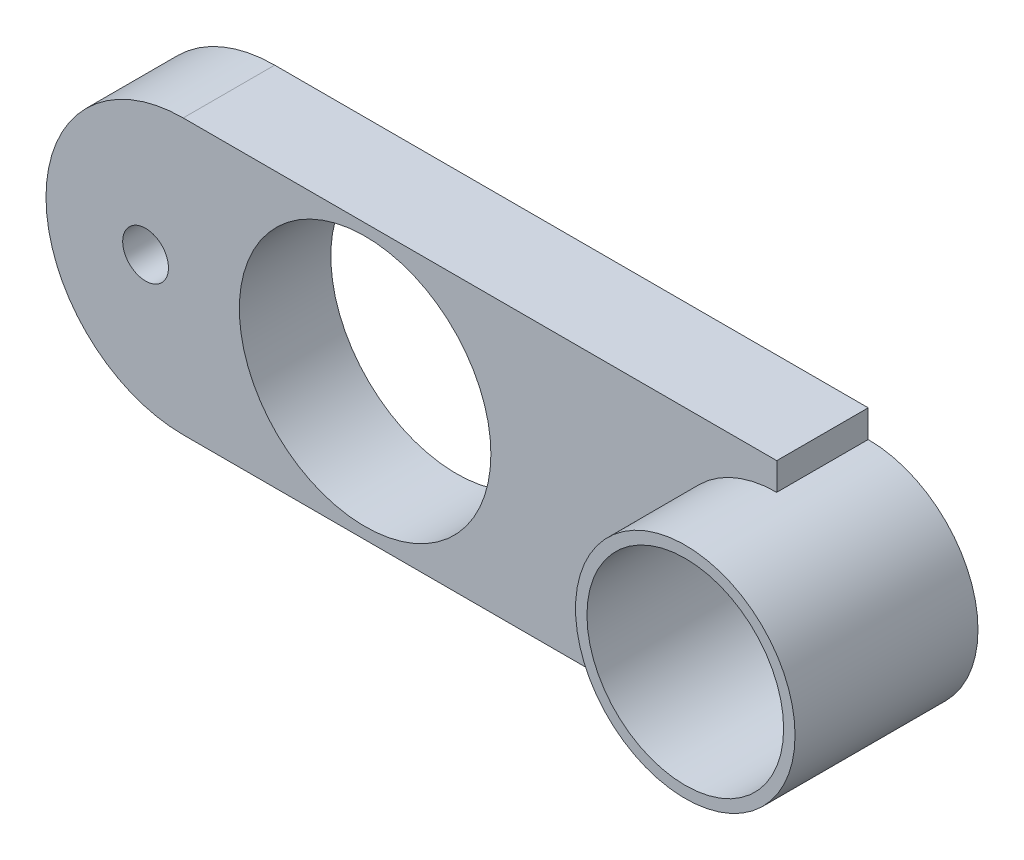
ISO-10303-21;
HEADER;
FILE_DESCRIPTION(('STEP AP214'),'2;1');
FILE_NAME('part.step','',(''),(''),'','','');
FILE_SCHEMA(('AUTOMOTIVE_DESIGN { 1 0 10303 214 1 1 1 1 }'));
ENDSEC;
DATA;
#1=APPLICATION_CONTEXT('core data for automotive mechanical design processes');
#2=APPLICATION_PROTOCOL_DEFINITION('international standard','automotive_design',2000,#1);
#3=PRODUCT_CONTEXT('',#1,'mechanical');
#4=PRODUCT('Part','Part','',(#3));
#5=PRODUCT_RELATED_PRODUCT_CATEGORY('part','',(#4));
#6=PRODUCT_DEFINITION_FORMATION('','',#4);
#7=PRODUCT_DEFINITION_CONTEXT('part definition',#1,'design');
#8=PRODUCT_DEFINITION('design','',#6,#7);
#9=PRODUCT_DEFINITION_SHAPE('','',#8);
#10=(LENGTH_UNIT() NAMED_UNIT(*) SI_UNIT(.MILLI.,.METRE.));
#11=(NAMED_UNIT(*) PLANE_ANGLE_UNIT() SI_UNIT($,.RADIAN.));
#12=(NAMED_UNIT(*) SI_UNIT($,.STERADIAN.) SOLID_ANGLE_UNIT());
#13=UNCERTAINTY_MEASURE_WITH_UNIT(LENGTH_MEASURE(1.E-05),#10,'distance_accuracy_value','');
#14=(GEOMETRIC_REPRESENTATION_CONTEXT(3) GLOBAL_UNCERTAINTY_ASSIGNED_CONTEXT((#13)) GLOBAL_UNIT_ASSIGNED_CONTEXT((#10,
#11,#12)) REPRESENTATION_CONTEXT('',''));
#15=CARTESIAN_POINT('',(0.,0.,0.));
#16=DIRECTION('',(0.,0.,1.));
#17=DIRECTION('',(1.,0.,0.));
#18=AXIS2_PLACEMENT_3D('',#15,#16,#17);
#19=CARTESIAN_POINT('',(-39.7700446225227,0.,0.));
#20=DIRECTION('',(0.,0.,-1.));
#21=DIRECTION('',(-1.,0.,0.));
#22=AXIS2_PLACEMENT_3D('',#19,#20,#21);
#23=CYLINDRICAL_SURFACE('',#22,30.);
#24=DIRECTION('',(0.,0.,1.));
#25=VECTOR('',#24,1.);
#26=CARTESIAN_POINT('',(-39.7700446225227,30.,0.));
#27=LINE('',#26,#25);
#28=CARTESIAN_POINT('',(-39.7700446225227,30.,0.));
#29=VERTEX_POINT('',#28);
#30=CARTESIAN_POINT('',(-39.7700446225227,30.,20.));
#31=VERTEX_POINT('',#30);
#32=EDGE_CURVE('E165',#29,#31,#27,.T.);
#33=ORIENTED_EDGE('',*,*,#32,.F.);
#34=CARTESIAN_POINT('',(-39.7700446225227,0.,0.));
#35=DIRECTION('',(0.,0.,1.));
#36=DIRECTION('',(1.,0.,0.));
#37=AXIS2_PLACEMENT_3D('',#34,#35,#36);
#38=CIRCLE('',#37,30.);
#39=CARTESIAN_POINT('',(-69.7700446225227,0.,0.));
#40=VERTEX_POINT('',#39);
#41=EDGE_CURVE('E44',#40,#29,#38,.F.);
#42=ORIENTED_EDGE('',*,*,#41,.F.);
#43=DIRECTION('',(0.,0.,-1.));
#44=VECTOR('',#43,1.);
#45=CARTESIAN_POINT('',(-69.7700446225227,0.,0.));
#46=LINE('',#45,#44);
#47=CARTESIAN_POINT('',(-69.7700446225227,0.,20.));
#48=VERTEX_POINT('',#47);
#49=EDGE_CURVE('E159',#40,#48,#46,.F.);
#50=ORIENTED_EDGE('',*,*,#49,.T.);
#51=CARTESIAN_POINT('',(-39.7700446225227,0.,20.));
#52=DIRECTION('',(0.,0.,1.));
#53=DIRECTION('',(1.,0.,0.));
#54=AXIS2_PLACEMENT_3D('',#51,#52,#53);
#55=CIRCLE('',#54,30.);
#56=EDGE_CURVE('E11',#31,#48,#55,.T.);
#57=ORIENTED_EDGE('',*,*,#56,.F.);
#58=EDGE_LOOP('',(#33,#42,#50,#57));
#59=FACE_BOUND('',#58,.T.);
#60=ADVANCED_FACE('F37',(#59),#23,.T.);
#61=CARTESIAN_POINT('',(-39.7700446225227,0.,0.));
#62=DIRECTION('',(0.,0.,1.));
#63=DIRECTION('',(1.,0.,0.));
#64=AXIS2_PLACEMENT_3D('',#61,#62,#63);
#65=CYLINDRICAL_SURFACE('',#64,30.);
#66=DIRECTION('',(0.,0.,-1.));
#67=VECTOR('',#66,1.);
#68=CARTESIAN_POINT('',(-39.7700446225227,-30.,0.));
#69=LINE('',#68,#67);
#70=CARTESIAN_POINT('',(-39.7700446225227,-30.,20.));
#71=VERTEX_POINT('',#70);
#72=CARTESIAN_POINT('',(-39.7700446225227,-30.,0.));
#73=VERTEX_POINT('',#72);
#74=EDGE_CURVE('E154',#71,#73,#69,.T.);
#75=ORIENTED_EDGE('',*,*,#74,.F.);
#76=CARTESIAN_POINT('',(-39.7700446225227,0.,20.));
#77=DIRECTION('',(0.,0.,1.));
#78=DIRECTION('',(1.,0.,0.));
#79=AXIS2_PLACEMENT_3D('',#76,#77,#78);
#80=CIRCLE('',#79,30.);
#81=EDGE_CURVE('E161',#48,#71,#80,.T.);
#82=ORIENTED_EDGE('',*,*,#81,.F.);
#83=ORIENTED_EDGE('',*,*,#49,.F.);
#84=CARTESIAN_POINT('',(-39.7700446225227,0.,0.));
#85=DIRECTION('',(0.,0.,1.));
#86=DIRECTION('',(1.,0.,0.));
#87=AXIS2_PLACEMENT_3D('',#84,#85,#86);
#88=CIRCLE('',#87,30.);
#89=EDGE_CURVE('E163',#73,#40,#88,.F.);
#90=ORIENTED_EDGE('',*,*,#89,.F.);
#91=EDGE_LOOP('',(#75,#82,#83,#90));
#92=FACE_BOUND('',#91,.T.);
#93=ADVANCED_FACE('F172',(#92),#65,.T.);
#94=CARTESIAN_POINT('',(0.,0.,20.));
#95=DIRECTION('',(0.,0.,1.));
#96=DIRECTION('',(1.,0.,0.));
#97=AXIS2_PLACEMENT_3D('',#94,#95,#96);
#98=PLANE('',#97);
#99=CARTESIAN_POINT('',(-48.,0.,20.));
#100=DIRECTION('',(0.,0.,1.));
#101=DIRECTION('',(1.,0.,0.));
#102=AXIS2_PLACEMENT_3D('',#99,#100,#101);
#103=CIRCLE('',#102,5.);
#104=CARTESIAN_POINT('',(-43.,0.,20.));
#105=VERTEX_POINT('',#104);
#106=EDGE_CURVE('E244',#105,#105,#103,.T.);
#107=ORIENTED_EDGE('',*,*,#106,.F.);
#108=EDGE_LOOP('',(#107));
#109=FACE_BOUND('',#108,.T.);
#110=DIRECTION('',(-1.,0.,0.));
#111=VECTOR('',#110,1.);
#112=CARTESIAN_POINT('',(0.,30.,20.));
#113=LINE('',#112,#111);
#114=CARTESIAN_POINT('',(90.,30.,20.));
#115=VERTEX_POINT('',#114);
#116=EDGE_CURVE('E103',#115,#31,#113,.T.);
#117=ORIENTED_EDGE('',*,*,#116,.T.);
#118=ORIENTED_EDGE('',*,*,#56,.T.);
#119=ORIENTED_EDGE('',*,*,#81,.T.);
#120=DIRECTION('',(1.,0.,0.));
#121=VECTOR('',#120,1.);
#122=CARTESIAN_POINT('',(0.,-30.,20.));
#123=LINE('',#122,#121);
#124=CARTESIAN_POINT('',(90.,-30.,20.));
#125=VERTEX_POINT('',#124);
#126=EDGE_CURVE('E124',#71,#125,#123,.T.);
#127=ORIENTED_EDGE('',*,*,#126,.T.);
#128=DIRECTION('',(0.,1.,0.));
#129=VECTOR('',#128,1.);
#130=CARTESIAN_POINT('',(90.,-30.,20.));
#131=LINE('',#130,#129);
#132=CARTESIAN_POINT('',(90.,-24.,20.));
#133=VERTEX_POINT('',#132);
#134=EDGE_CURVE('E104',#125,#133,#131,.T.);
#135=ORIENTED_EDGE('',*,*,#134,.T.);
#136=CARTESIAN_POINT('',(90.,0.,20.));
#137=DIRECTION('',(0.,0.,1.));
#138=DIRECTION('',(1.,0.,0.));
#139=AXIS2_PLACEMENT_3D('',#136,#137,#138);
#140=CIRCLE('',#139,24.);
#141=CARTESIAN_POINT('',(90.,24.,20.));
#142=VERTEX_POINT('',#141);
#143=EDGE_CURVE('E111',#142,#133,#140,.T.);
#144=ORIENTED_EDGE('',*,*,#143,.F.);
#145=DIRECTION('',(0.,1.,0.));
#146=VECTOR('',#145,1.);
#147=CARTESIAN_POINT('',(90.,30.,20.));
#148=LINE('',#147,#146);
#149=EDGE_CURVE('E92',#142,#115,#148,.T.);
#150=ORIENTED_EDGE('',*,*,#149,.T.);
#151=EDGE_LOOP('',(#117,#118,#119,#127,#135,#144,#150));
#152=FACE_BOUND('',#151,.T.);
#153=CARTESIAN_POINT('',(0.,0.,20.));
#154=DIRECTION('',(0.,0.,1.));
#155=DIRECTION('',(1.,0.,0.));
#156=AXIS2_PLACEMENT_3D('',#153,#154,#155);
#157=CIRCLE('',#156,27.5);
#158=CARTESIAN_POINT('',(27.5,0.,20.));
#159=VERTEX_POINT('',#158);
#160=EDGE_CURVE('E146',#159,#159,#157,.T.);
#161=ORIENTED_EDGE('',*,*,#160,.F.);
#162=EDGE_LOOP('',(#161));
#163=FACE_BOUND('',#162,.T.);
#164=ADVANCED_FACE('F117',(#109,#152,#163),#98,.T.);
#165=CARTESIAN_POINT('',(0.,0.,0.));
#166=DIRECTION('',(0.,0.,1.));
#167=DIRECTION('',(1.,0.,0.));
#168=AXIS2_PLACEMENT_3D('',#165,#166,#167);
#169=PLANE('',#168);
#170=CARTESIAN_POINT('',(-48.,0.,0.));
#171=DIRECTION('',(0.,0.,1.));
#172=DIRECTION('',(1.,0.,0.));
#173=AXIS2_PLACEMENT_3D('',#170,#171,#172);
#174=CIRCLE('',#173,5.);
#175=CARTESIAN_POINT('',(-43.,0.,0.));
#176=VERTEX_POINT('',#175);
#177=EDGE_CURVE('E241',#176,#176,#174,.T.);
#178=ORIENTED_EDGE('',*,*,#177,.T.);
#179=EDGE_LOOP('',(#178));
#180=FACE_BOUND('',#179,.T.);
#181=CARTESIAN_POINT('',(0.,0.,0.));
#182=DIRECTION('',(0.,0.,1.));
#183=DIRECTION('',(1.,0.,0.));
#184=AXIS2_PLACEMENT_3D('',#181,#182,#183);
#185=CIRCLE('',#184,27.5);
#186=CARTESIAN_POINT('',(27.5,0.,0.));
#187=VERTEX_POINT('',#186);
#188=EDGE_CURVE('E151',#187,#187,#185,.T.);
#189=ORIENTED_EDGE('',*,*,#188,.T.);
#190=EDGE_LOOP('',(#189));
#191=FACE_BOUND('',#190,.T.);
#192=ORIENTED_EDGE('',*,*,#89,.T.);
#193=ORIENTED_EDGE('',*,*,#41,.T.);
#194=DIRECTION('',(-1.,0.,0.));
#195=VECTOR('',#194,1.);
#196=CARTESIAN_POINT('',(0.,30.,0.));
#197=LINE('',#196,#195);
#198=CARTESIAN_POINT('',(90.,30.,0.));
#199=VERTEX_POINT('',#198);
#200=EDGE_CURVE('E139',#199,#29,#197,.T.);
#201=ORIENTED_EDGE('',*,*,#200,.F.);
#202=DIRECTION('',(0.,1.,0.));
#203=VECTOR('',#202,1.);
#204=CARTESIAN_POINT('',(90.,30.,0.));
#205=LINE('',#204,#203);
#206=CARTESIAN_POINT('',(90.,24.,0.));
#207=VERTEX_POINT('',#206);
#208=EDGE_CURVE('E137',#207,#199,#205,.T.);
#209=ORIENTED_EDGE('',*,*,#208,.F.);
#210=CARTESIAN_POINT('',(90.,0.,0.));
#211=DIRECTION('',(0.,0.,1.));
#212=DIRECTION('',(1.,0.,0.));
#213=AXIS2_PLACEMENT_3D('',#210,#211,#212);
#214=CIRCLE('',#213,24.);
#215=CARTESIAN_POINT('',(90.,-24.,0.));
#216=VERTEX_POINT('',#215);
#217=EDGE_CURVE('E113',#216,#207,#214,.T.);
#218=ORIENTED_EDGE('',*,*,#217,.F.);
#219=DIRECTION('',(0.,1.,0.));
#220=VECTOR('',#219,1.);
#221=CARTESIAN_POINT('',(90.,-30.,0.));
#222=LINE('',#221,#220);
#223=CARTESIAN_POINT('',(90.,-30.,0.));
#224=VERTEX_POINT('',#223);
#225=EDGE_CURVE('E133',#224,#216,#222,.T.);
#226=ORIENTED_EDGE('',*,*,#225,.F.);
#227=DIRECTION('',(1.,0.,0.));
#228=VECTOR('',#227,1.);
#229=CARTESIAN_POINT('',(0.,-30.,0.));
#230=LINE('',#229,#228);
#231=EDGE_CURVE('E131',#73,#224,#230,.T.);
#232=ORIENTED_EDGE('',*,*,#231,.F.);
#233=EDGE_LOOP('',(#192,#193,#201,#209,#218,#226,#232));
#234=FACE_BOUND('',#233,.T.);
#235=ADVANCED_FACE('F175',(#180,#191,#234),#169,.F.);
#236=CARTESIAN_POINT('',(0.,0.,0.));
#237=DIRECTION('',(0.,0.,1.));
#238=DIRECTION('',(1.,0.,0.));
#239=AXIS2_PLACEMENT_3D('',#236,#237,#238);
#240=CYLINDRICAL_SURFACE('',#239,27.5);
#241=ORIENTED_EDGE('',*,*,#188,.F.);
#242=EDGE_LOOP('',(#241));
#243=FACE_BOUND('',#242,.T.);
#244=ORIENTED_EDGE('',*,*,#160,.T.);
#245=EDGE_LOOP('',(#244));
#246=FACE_BOUND('',#245,.T.);
#247=ADVANCED_FACE('F204',(#243,#246),#240,.F.);
#248=CARTESIAN_POINT('',(0.,30.,0.));
#249=DIRECTION('',(0.,1.,0.));
#250=DIRECTION('',(0.,0.,1.));
#251=AXIS2_PLACEMENT_3D('',#248,#249,#250);
#252=PLANE('',#251);
#253=ORIENTED_EDGE('',*,*,#200,.T.);
#254=ORIENTED_EDGE('',*,*,#32,.T.);
#255=ORIENTED_EDGE('',*,*,#116,.F.);
#256=DIRECTION('',(0.,0.,1.));
#257=VECTOR('',#256,1.);
#258=CARTESIAN_POINT('',(90.,30.,0.));
#259=LINE('',#258,#257);
#260=EDGE_CURVE('E98',#199,#115,#259,.T.);
#261=ORIENTED_EDGE('',*,*,#260,.F.);
#262=EDGE_LOOP('',(#253,#254,#255,#261));
#263=FACE_BOUND('',#262,.T.);
#264=ADVANCED_FACE('F167',(#263),#252,.T.);
#265=CARTESIAN_POINT('',(90.,30.,0.));
#266=DIRECTION('',(1.,0.,0.));
#267=DIRECTION('',(0.,0.,-1.));
#268=AXIS2_PLACEMENT_3D('',#265,#266,#267);
#269=PLANE('',#268);
#270=ORIENTED_EDGE('',*,*,#149,.F.);
#271=DIRECTION('',(0.,0.,1.));
#272=VECTOR('',#271,1.);
#273=CARTESIAN_POINT('',(90.,24.,0.));
#274=LINE('',#273,#272);
#275=EDGE_CURVE('E96',#207,#142,#274,.T.);
#276=ORIENTED_EDGE('',*,*,#275,.F.);
#277=ORIENTED_EDGE('',*,*,#208,.T.);
#278=ORIENTED_EDGE('',*,*,#260,.T.);
#279=EDGE_LOOP('',(#270,#276,#277,#278));
#280=FACE_BOUND('',#279,.T.);
#281=ADVANCED_FACE('F94',(#280),#269,.T.);
#282=CARTESIAN_POINT('',(90.,0.,0.));
#283=DIRECTION('',(0.,0.,1.));
#284=DIRECTION('',(1.,0.,0.));
#285=AXIS2_PLACEMENT_3D('',#282,#283,#284);
#286=CYLINDRICAL_SURFACE('',#285,24.);
#287=ORIENTED_EDGE('',*,*,#275,.T.);
#288=ORIENTED_EDGE('',*,*,#143,.T.);
#289=DIRECTION('',(0.,0.,1.));
#290=VECTOR('',#289,1.);
#291=CARTESIAN_POINT('',(90.,-24.,0.));
#292=LINE('',#291,#290);
#293=EDGE_CURVE('E114',#216,#133,#292,.T.);
#294=ORIENTED_EDGE('',*,*,#293,.F.);
#295=ORIENTED_EDGE('',*,*,#217,.T.);
#296=EDGE_LOOP('',(#287,#288,#294,#295));
#297=FACE_BOUND('',#296,.T.);
#298=CARTESIAN_POINT('',(90.,0.,40.));
#299=DIRECTION('',(0.,0.,1.));
#300=DIRECTION('',(1.,0.,0.));
#301=AXIS2_PLACEMENT_3D('',#298,#299,#300);
#302=CIRCLE('',#301,24.);
#303=CARTESIAN_POINT('',(114.,0.,40.));
#304=VERTEX_POINT('',#303);
#305=EDGE_CURVE('E120',#304,#304,#302,.T.);
#306=ORIENTED_EDGE('',*,*,#305,.F.);
#307=EDGE_LOOP('',(#306));
#308=FACE_BOUND('',#307,.T.);
#309=ADVANCED_FACE('F109',(#297,#308),#286,.T.);
#310=CARTESIAN_POINT('',(90.,-30.,0.));
#311=DIRECTION('',(1.,0.,0.));
#312=DIRECTION('',(0.,0.,-1.));
#313=AXIS2_PLACEMENT_3D('',#310,#311,#312);
#314=PLANE('',#313);
#315=ORIENTED_EDGE('',*,*,#134,.F.);
#316=DIRECTION('',(0.,0.,1.));
#317=VECTOR('',#316,1.);
#318=CARTESIAN_POINT('',(90.,-30.,0.));
#319=LINE('',#318,#317);
#320=EDGE_CURVE('E142',#224,#125,#319,.T.);
#321=ORIENTED_EDGE('',*,*,#320,.F.);
#322=ORIENTED_EDGE('',*,*,#225,.T.);
#323=ORIENTED_EDGE('',*,*,#293,.T.);
#324=EDGE_LOOP('',(#315,#321,#322,#323));
#325=FACE_BOUND('',#324,.T.);
#326=ADVANCED_FACE('F181',(#325),#314,.T.);
#327=CARTESIAN_POINT('',(0.,-30.,0.));
#328=DIRECTION('',(0.,-1.,0.));
#329=DIRECTION('',(0.,0.,-1.));
#330=AXIS2_PLACEMENT_3D('',#327,#328,#329);
#331=PLANE('',#330);
#332=ORIENTED_EDGE('',*,*,#126,.F.);
#333=ORIENTED_EDGE('',*,*,#74,.T.);
#334=ORIENTED_EDGE('',*,*,#231,.T.);
#335=ORIENTED_EDGE('',*,*,#320,.T.);
#336=EDGE_LOOP('',(#332,#333,#334,#335));
#337=FACE_BOUND('',#336,.T.);
#338=ADVANCED_FACE('F178',(#337),#331,.T.);
#339=CARTESIAN_POINT('',(90.,0.,40.));
#340=DIRECTION('',(0.,0.,1.));
#341=DIRECTION('',(1.,0.,0.));
#342=AXIS2_PLACEMENT_3D('',#339,#340,#341);
#343=PLANE('',#342);
#344=CARTESIAN_POINT('',(90.,0.,40.));
#345=DIRECTION('',(0.,0.,1.));
#346=DIRECTION('',(1.,0.,0.));
#347=AXIS2_PLACEMENT_3D('',#344,#345,#346);
#348=CIRCLE('',#347,21.5);
#349=CARTESIAN_POINT('',(111.5,0.,40.));
#350=VERTEX_POINT('',#349);
#351=EDGE_CURVE('E127',#350,#350,#348,.T.);
#352=ORIENTED_EDGE('',*,*,#351,.F.);
#353=EDGE_LOOP('',(#352));
#354=FACE_BOUND('',#353,.T.);
#355=ORIENTED_EDGE('',*,*,#305,.T.);
#356=EDGE_LOOP('',(#355));
#357=FACE_BOUND('',#356,.T.);
#358=ADVANCED_FACE('F189',(#354,#357),#343,.T.);
#359=CARTESIAN_POINT('',(90.,0.,4.99999999999999));
#360=DIRECTION('',(0.,0.,1.));
#361=DIRECTION('',(1.,0.,0.));
#362=AXIS2_PLACEMENT_3D('',#359,#360,#361);
#363=CYLINDRICAL_SURFACE('',#362,21.5);
#364=CARTESIAN_POINT('',(90.,0.,4.99999999999999));
#365=DIRECTION('',(0.,0.,1.));
#366=DIRECTION('',(1.,0.,0.));
#367=AXIS2_PLACEMENT_3D('',#364,#365,#366);
#368=CIRCLE('',#367,21.5);
#369=CARTESIAN_POINT('',(111.5,0.,4.99999999999999));
#370=VERTEX_POINT('',#369);
#371=EDGE_CURVE('E121',#370,#370,#368,.T.);
#372=ORIENTED_EDGE('',*,*,#371,.F.);
#373=EDGE_LOOP('',(#372));
#374=FACE_BOUND('',#373,.T.);
#375=ORIENTED_EDGE('',*,*,#351,.T.);
#376=EDGE_LOOP('',(#375));
#377=FACE_BOUND('',#376,.T.);
#378=ADVANCED_FACE('F225',(#374,#377),#363,.F.);
#379=CARTESIAN_POINT('',(90.,0.,4.99999999999999));
#380=DIRECTION('',(0.,0.,1.));
#381=DIRECTION('',(1.,0.,0.));
#382=AXIS2_PLACEMENT_3D('',#379,#380,#381);
#383=PLANE('',#382);
#384=ORIENTED_EDGE('',*,*,#371,.T.);
#385=EDGE_LOOP('',(#384));
#386=FACE_BOUND('',#385,.T.);
#387=ADVANCED_FACE('F229',(#386),#383,.T.);
#388=CARTESIAN_POINT('',(-48.,0.,0.));
#389=DIRECTION('',(0.,0.,1.));
#390=DIRECTION('',(1.,0.,0.));
#391=AXIS2_PLACEMENT_3D('',#388,#389,#390);
#392=CYLINDRICAL_SURFACE('',#391,5.);
#393=ORIENTED_EDGE('',*,*,#177,.F.);
#394=EDGE_LOOP('',(#393));
#395=FACE_BOUND('',#394,.T.);
#396=ORIENTED_EDGE('',*,*,#106,.T.);
#397=EDGE_LOOP('',(#396));
#398=FACE_BOUND('',#397,.T.);
#399=ADVANCED_FACE('F233',(#395,#398),#392,.F.);
#400=CLOSED_SHELL('',(#60,#93,#164,#235,#247,#264,#281,#309,#326,#338,#358,#378,#387,#399));
#401=MANIFOLD_SOLID_BREP('B2',#400);
#402=ADVANCED_BREP_SHAPE_REPRESENTATION('',(#18,#401),#14);
#403=SHAPE_DEFINITION_REPRESENTATION(#9,#402);
ENDSEC;
END-ISO-10303-21;
